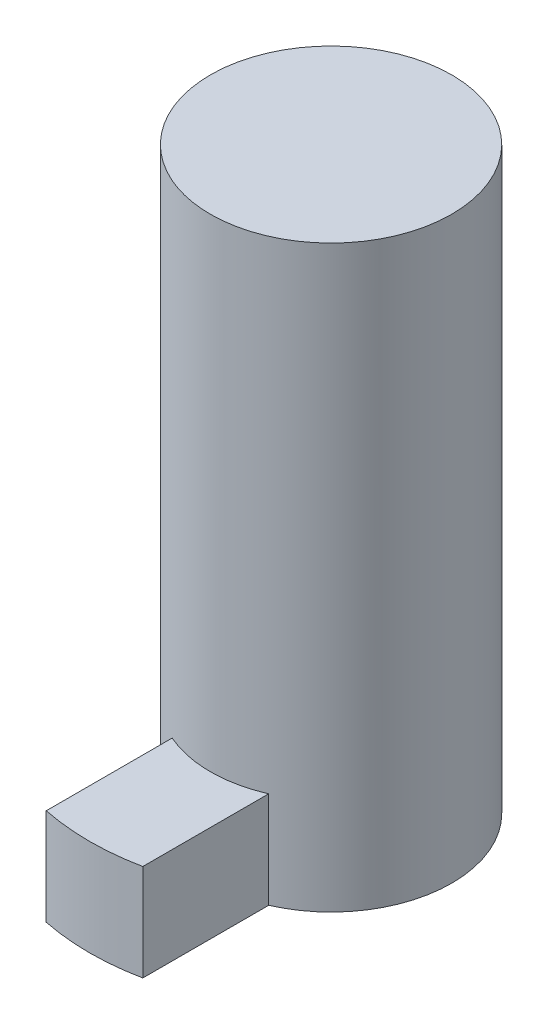
ISO-10303-21;
HEADER;
FILE_DESCRIPTION(('STEP AP214'),'2;1');
FILE_NAME('part.step','',(''),(''),'','','');
FILE_SCHEMA(('AUTOMOTIVE_DESIGN { 1 0 10303 214 1 1 1 1 }'));
ENDSEC;
DATA;
#1=APPLICATION_CONTEXT('core data for automotive mechanical design processes');
#2=APPLICATION_PROTOCOL_DEFINITION('international standard','automotive_design',2000,#1);
#3=PRODUCT_CONTEXT('',#1,'mechanical');
#4=PRODUCT('Part','Part','',(#3));
#5=PRODUCT_RELATED_PRODUCT_CATEGORY('part','',(#4));
#6=PRODUCT_DEFINITION_FORMATION('','',#4);
#7=PRODUCT_DEFINITION_CONTEXT('part definition',#1,'design');
#8=PRODUCT_DEFINITION('design','',#6,#7);
#9=PRODUCT_DEFINITION_SHAPE('','',#8);
#10=(LENGTH_UNIT() NAMED_UNIT(*) SI_UNIT(.MILLI.,.METRE.));
#11=(NAMED_UNIT(*) PLANE_ANGLE_UNIT() SI_UNIT($,.RADIAN.));
#12=(NAMED_UNIT(*) SI_UNIT($,.STERADIAN.) SOLID_ANGLE_UNIT());
#13=UNCERTAINTY_MEASURE_WITH_UNIT(LENGTH_MEASURE(1.E-05),#10,'distance_accuracy_value','');
#14=(GEOMETRIC_REPRESENTATION_CONTEXT(3) GLOBAL_UNCERTAINTY_ASSIGNED_CONTEXT((#13)) GLOBAL_UNIT_ASSIGNED_CONTEXT((#10,
#11,#12)) REPRESENTATION_CONTEXT('',''));
#15=CARTESIAN_POINT('',(0.,0.,0.));
#16=DIRECTION('',(0.,0.,1.));
#17=DIRECTION('',(1.,0.,0.));
#18=AXIS2_PLACEMENT_3D('',#15,#16,#17);
#19=CARTESIAN_POINT('',(0.,6.,0.));
#20=DIRECTION('',(0.,-1.,0.));
#21=DIRECTION('',(0.,0.,-1.));
#22=AXIS2_PLACEMENT_3D('',#19,#20,#21);
#23=CYLINDRICAL_SURFACE('',#22,1.25);
#24=CARTESIAN_POINT('',(0.,0.,0.));
#25=DIRECTION('',(0.,1.,0.));
#26=DIRECTION('',(0.,0.,1.));
#27=AXIS2_PLACEMENT_3D('',#24,#25,#26);
#28=CIRCLE('',#27,1.25);
#29=CARTESIAN_POINT('',(0.5,0.,1.14564392373896));
#30=VERTEX_POINT('',#29);
#31=CARTESIAN_POINT('',(-0.5,0.,1.14564392373896));
#32=VERTEX_POINT('',#31);
#33=EDGE_CURVE('E41',#30,#32,#28,.T.);
#34=ORIENTED_EDGE('',*,*,#33,.T.);
#35=DIRECTION('',(0.,-1.,0.));
#36=VECTOR('',#35,1.);
#37=CARTESIAN_POINT('',(-0.5,1.,1.14564392373896));
#38=LINE('',#37,#36);
#39=CARTESIAN_POINT('',(-0.5,1.,1.14564392373896));
#40=VERTEX_POINT('',#39);
#41=EDGE_CURVE('E52',#40,#32,#38,.T.);
#42=ORIENTED_EDGE('',*,*,#41,.F.);
#43=CARTESIAN_POINT('',(0.,1.,0.));
#44=DIRECTION('',(0.,1.,0.));
#45=DIRECTION('',(0.,0.,-1.));
#46=AXIS2_PLACEMENT_3D('',#43,#44,#45);
#47=CIRCLE('',#46,1.25);
#48=CARTESIAN_POINT('',(0.5,1.,1.14564392373896));
#49=VERTEX_POINT('',#48);
#50=EDGE_CURVE('E56',#40,#49,#47,.T.);
#51=ORIENTED_EDGE('',*,*,#50,.T.);
#52=DIRECTION('',(0.,-1.,0.));
#53=VECTOR('',#52,1.);
#54=CARTESIAN_POINT('',(0.5,1.,1.14564392373896));
#55=LINE('',#54,#53);
#56=EDGE_CURVE('E89',#49,#30,#55,.T.);
#57=ORIENTED_EDGE('',*,*,#56,.T.);
#58=EDGE_LOOP('',(#34,#42,#51,#57));
#59=FACE_BOUND('',#58,.T.);
#60=CARTESIAN_POINT('',(0.,6.,0.));
#61=DIRECTION('',(0.,1.,0.));
#62=DIRECTION('',(0.,0.,1.));
#63=AXIS2_PLACEMENT_3D('',#60,#61,#62);
#64=CIRCLE('',#63,1.25);
#65=CARTESIAN_POINT('',(0.,6.,1.25));
#66=VERTEX_POINT('',#65);
#67=EDGE_CURVE('E11',#66,#66,#64,.T.);
#68=ORIENTED_EDGE('',*,*,#67,.F.);
#69=EDGE_LOOP('',(#68));
#70=FACE_BOUND('',#69,.T.);
#71=ADVANCED_FACE('F38',(#59,#70),#23,.T.);
#72=CARTESIAN_POINT('',(0.,6.,0.));
#73=DIRECTION('',(0.,1.,0.));
#74=DIRECTION('',(0.,0.,1.));
#75=AXIS2_PLACEMENT_3D('',#72,#73,#74);
#76=PLANE('',#75);
#77=ORIENTED_EDGE('',*,*,#67,.T.);
#78=EDGE_LOOP('',(#77));
#79=FACE_BOUND('',#78,.T.);
#80=ADVANCED_FACE('F124',(#79),#76,.T.);
#81=CARTESIAN_POINT('',(0.,0.,0.));
#82=DIRECTION('',(0.,1.,0.));
#83=DIRECTION('',(0.,0.,1.));
#84=AXIS2_PLACEMENT_3D('',#81,#82,#83);
#85=PLANE('',#84);
#86=ORIENTED_EDGE('',*,*,#33,.F.);
#87=DIRECTION('',(0.,0.,1.));
#88=VECTOR('',#87,1.);
#89=CARTESIAN_POINT('',(0.5,0.,2.44948974278318));
#90=LINE('',#89,#88);
#91=CARTESIAN_POINT('',(0.500000000000001,0.,2.44948974278318));
#92=VERTEX_POINT('',#91);
#93=EDGE_CURVE('E104',#30,#92,#90,.T.);
#94=ORIENTED_EDGE('',*,*,#93,.T.);
#95=CARTESIAN_POINT('',(0.,0.,0.));
#96=DIRECTION('',(0.,-1.,0.));
#97=DIRECTION('',(0.,0.,-1.));
#98=AXIS2_PLACEMENT_3D('',#95,#96,#97);
#99=CIRCLE('',#98,2.5);
#100=CARTESIAN_POINT('',(-0.5,0.,2.44948974278318));
#101=VERTEX_POINT('',#100);
#102=EDGE_CURVE('E83',#92,#101,#99,.T.);
#103=ORIENTED_EDGE('',*,*,#102,.T.);
#104=DIRECTION('',(0.,0.,-1.));
#105=VECTOR('',#104,1.);
#106=CARTESIAN_POINT('',(-0.5,0.,2.44948974278318));
#107=LINE('',#106,#105);
#108=EDGE_CURVE('E100',#101,#32,#107,.T.);
#109=ORIENTED_EDGE('',*,*,#108,.T.);
#110=EDGE_LOOP('',(#86,#94,#103,#109));
#111=FACE_BOUND('',#110,.T.);
#112=ADVANCED_FACE('F113',(#111),#85,.F.);
#113=CARTESIAN_POINT('',(-0.5,1.,2.44948974278318));
#114=DIRECTION('',(-1.,0.,0.));
#115=DIRECTION('',(0.,0.,1.));
#116=AXIS2_PLACEMENT_3D('',#113,#114,#115);
#117=PLANE('',#116);
#118=ORIENTED_EDGE('',*,*,#108,.F.);
#119=DIRECTION('',(0.,-1.,0.));
#120=VECTOR('',#119,1.);
#121=CARTESIAN_POINT('',(-0.5,1.,2.44948974278318));
#122=LINE('',#121,#120);
#123=CARTESIAN_POINT('',(-0.5,1.,2.44948974278318));
#124=VERTEX_POINT('',#123);
#125=EDGE_CURVE('E88',#124,#101,#122,.T.);
#126=ORIENTED_EDGE('',*,*,#125,.F.);
#127=DIRECTION('',(0.,0.,-1.));
#128=VECTOR('',#127,1.);
#129=CARTESIAN_POINT('',(-0.5,1.,2.44948974278318));
#130=LINE('',#129,#128);
#131=EDGE_CURVE('E96',#124,#40,#130,.T.);
#132=ORIENTED_EDGE('',*,*,#131,.T.);
#133=ORIENTED_EDGE('',*,*,#41,.T.);
#134=EDGE_LOOP('',(#118,#126,#132,#133));
#135=FACE_BOUND('',#134,.T.);
#136=ADVANCED_FACE('F116',(#135),#117,.T.);
#137=CARTESIAN_POINT('',(0.,1.,0.));
#138=DIRECTION('',(0.,-1.,0.));
#139=DIRECTION('',(0.,0.,-1.));
#140=AXIS2_PLACEMENT_3D('',#137,#138,#139);
#141=CYLINDRICAL_SURFACE('',#140,2.5);
#142=ORIENTED_EDGE('',*,*,#102,.F.);
#143=DIRECTION('',(0.,-1.,0.));
#144=VECTOR('',#143,1.);
#145=CARTESIAN_POINT('',(0.500000000000001,1.,2.44948974278318));
#146=LINE('',#145,#144);
#147=CARTESIAN_POINT('',(0.500000000000001,1.,2.44948974278318));
#148=VERTEX_POINT('',#147);
#149=EDGE_CURVE('E77',#148,#92,#146,.T.);
#150=ORIENTED_EDGE('',*,*,#149,.F.);
#151=CARTESIAN_POINT('',(0.,1.,0.));
#152=DIRECTION('',(0.,-1.,0.));
#153=DIRECTION('',(0.,0.,-1.));
#154=AXIS2_PLACEMENT_3D('',#151,#152,#153);
#155=CIRCLE('',#154,2.5);
#156=EDGE_CURVE('E80',#148,#124,#155,.T.);
#157=ORIENTED_EDGE('',*,*,#156,.T.);
#158=ORIENTED_EDGE('',*,*,#125,.T.);
#159=EDGE_LOOP('',(#142,#150,#157,#158));
#160=FACE_BOUND('',#159,.T.);
#161=ADVANCED_FACE('F79',(#160),#141,.T.);
#162=CARTESIAN_POINT('',(0.5,1.,2.44948974278318));
#163=DIRECTION('',(1.,0.,0.));
#164=DIRECTION('',(0.,0.,-1.));
#165=AXIS2_PLACEMENT_3D('',#162,#163,#164);
#166=PLANE('',#165);
#167=ORIENTED_EDGE('',*,*,#93,.F.);
#168=ORIENTED_EDGE('',*,*,#56,.F.);
#169=DIRECTION('',(0.,0.,1.));
#170=VECTOR('',#169,1.);
#171=CARTESIAN_POINT('',(0.5,1.,2.44948974278318));
#172=LINE('',#171,#170);
#173=EDGE_CURVE('E94',#49,#148,#172,.T.);
#174=ORIENTED_EDGE('',*,*,#173,.T.);
#175=ORIENTED_EDGE('',*,*,#149,.T.);
#176=EDGE_LOOP('',(#167,#168,#174,#175));
#177=FACE_BOUND('',#176,.T.);
#178=ADVANCED_FACE('F98',(#177),#166,.T.);
#179=CARTESIAN_POINT('',(0.,1.,0.));
#180=DIRECTION('',(0.,-1.,0.));
#181=DIRECTION('',(0.,0.,-1.));
#182=AXIS2_PLACEMENT_3D('',#179,#180,#181);
#183=PLANE('',#182);
#184=ORIENTED_EDGE('',*,*,#50,.F.);
#185=ORIENTED_EDGE('',*,*,#131,.F.);
#186=ORIENTED_EDGE('',*,*,#156,.F.);
#187=ORIENTED_EDGE('',*,*,#173,.F.);
#188=EDGE_LOOP('',(#184,#185,#186,#187));
#189=FACE_BOUND('',#188,.T.);
#190=ADVANCED_FACE('F93',(#189),#183,.F.);
#191=CLOSED_SHELL('',(#71,#80,#112,#136,#161,#178,#190));
#192=MANIFOLD_SOLID_BREP('B2',#191);
#193=ADVANCED_BREP_SHAPE_REPRESENTATION('',(#18,#192),#14);
#194=SHAPE_DEFINITION_REPRESENTATION(#9,#193);
ENDSEC;
END-ISO-10303-21;
